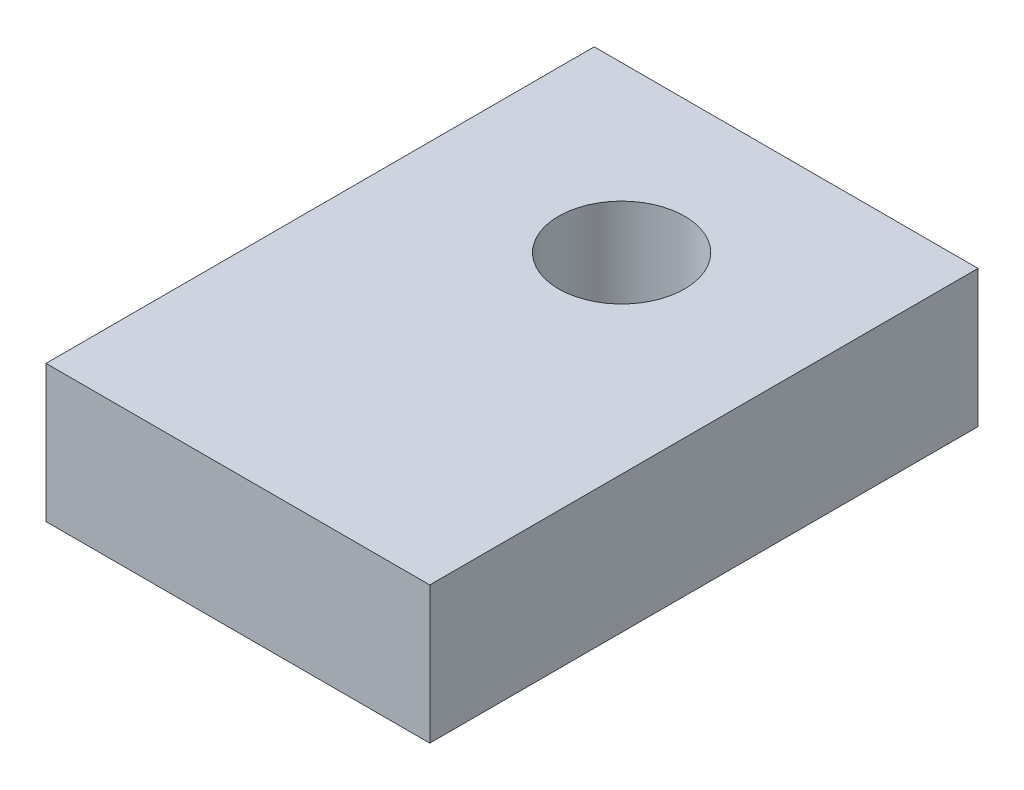
ISO-10303-21;
HEADER;
FILE_DESCRIPTION(('STEP AP214'),'2;1');
FILE_NAME('part.step','',(''),(''),'','','');
FILE_SCHEMA(('AUTOMOTIVE_DESIGN { 1 0 10303 214 1 1 1 1 }'));
ENDSEC;
DATA;
#1=APPLICATION_CONTEXT('core data for automotive mechanical design processes');
#2=APPLICATION_PROTOCOL_DEFINITION('international standard','automotive_design',2000,#1);
#3=PRODUCT_CONTEXT('',#1,'mechanical');
#4=PRODUCT('Part','Part','',(#3));
#5=PRODUCT_RELATED_PRODUCT_CATEGORY('part','',(#4));
#6=PRODUCT_DEFINITION_FORMATION('','',#4);
#7=PRODUCT_DEFINITION_CONTEXT('part definition',#1,'design');
#8=PRODUCT_DEFINITION('design','',#6,#7);
#9=PRODUCT_DEFINITION_SHAPE('','',#8);
#10=(LENGTH_UNIT() NAMED_UNIT(*) SI_UNIT(.MILLI.,.METRE.));
#11=(NAMED_UNIT(*) PLANE_ANGLE_UNIT() SI_UNIT($,.RADIAN.));
#12=(NAMED_UNIT(*) SI_UNIT($,.STERADIAN.) SOLID_ANGLE_UNIT());
#13=UNCERTAINTY_MEASURE_WITH_UNIT(LENGTH_MEASURE(1.E-05),#10,'distance_accuracy_value','');
#14=(GEOMETRIC_REPRESENTATION_CONTEXT(3) GLOBAL_UNCERTAINTY_ASSIGNED_CONTEXT((#13)) GLOBAL_UNIT_ASSIGNED_CONTEXT((#10,
#11,#12)) REPRESENTATION_CONTEXT('',''));
#15=CARTESIAN_POINT('',(0.,0.,0.));
#16=DIRECTION('',(0.,0.,1.));
#17=DIRECTION('',(1.,0.,0.));
#18=AXIS2_PLACEMENT_3D('',#15,#16,#17);
#19=CARTESIAN_POINT('',(0.,3.175,0.));
#20=DIRECTION('',(0.,-1.,0.));
#21=DIRECTION('',(0.,0.,-1.));
#22=AXIS2_PLACEMENT_3D('',#19,#20,#21);
#23=PLANE('',#22);
#24=DIRECTION('',(0.,0.,1.));
#25=VECTOR('',#24,1.);
#26=CARTESIAN_POINT('',(0.,3.175,0.));
#27=LINE('',#26,#25);
#28=CARTESIAN_POINT('',(0.,3.175,-12.7));
#29=VERTEX_POINT('',#28);
#30=CARTESIAN_POINT('',(0.,3.175,0.));
#31=VERTEX_POINT('',#30);
#32=EDGE_CURVE('E91',#29,#31,#27,.T.);
#33=ORIENTED_EDGE('',*,*,#32,.T.);
#34=DIRECTION('',(1.,0.,0.));
#35=VECTOR('',#34,1.);
#36=CARTESIAN_POINT('',(0.,3.175,0.));
#37=LINE('',#36,#35);
#38=CARTESIAN_POINT('',(8.89,3.175,0.));
#39=VERTEX_POINT('',#38);
#40=EDGE_CURVE('E86',#31,#39,#37,.T.);
#41=ORIENTED_EDGE('',*,*,#40,.T.);
#42=DIRECTION('',(0.,0.,-1.));
#43=VECTOR('',#42,1.);
#44=CARTESIAN_POINT('',(8.89,3.175,0.));
#45=LINE('',#44,#43);
#46=CARTESIAN_POINT('',(8.89,3.175,-12.7));
#47=VERTEX_POINT('',#46);
#48=EDGE_CURVE('E89',#39,#47,#45,.T.);
#49=ORIENTED_EDGE('',*,*,#48,.T.);
#50=DIRECTION('',(-1.,0.,0.));
#51=VECTOR('',#50,1.);
#52=CARTESIAN_POINT('',(0.,3.175,-12.7));
#53=LINE('',#52,#51);
#54=EDGE_CURVE('E56',#47,#29,#53,.T.);
#55=ORIENTED_EDGE('',*,*,#54,.T.);
#56=EDGE_LOOP('',(#33,#41,#49,#55));
#57=FACE_BOUND('',#56,.T.);
#58=CARTESIAN_POINT('',(4.445,3.175,-8.89));
#59=DIRECTION('',(0.,1.,0.));
#60=DIRECTION('',(0.,0.,1.));
#61=AXIS2_PLACEMENT_3D('',#58,#59,#60);
#62=CIRCLE('',#61,1.4605);
#63=CARTESIAN_POINT('',(4.445,3.175,-7.4295));
#64=VERTEX_POINT('',#63);
#65=EDGE_CURVE('E106',#64,#64,#62,.T.);
#66=ORIENTED_EDGE('',*,*,#65,.F.);
#67=EDGE_LOOP('',(#66));
#68=FACE_BOUND('',#67,.T.);
#69=ADVANCED_FACE('F39',(#57,#68),#23,.F.);
#70=CARTESIAN_POINT('',(0.,0.,0.));
#71=DIRECTION('',(0.,-1.,0.));
#72=DIRECTION('',(0.,0.,-1.));
#73=AXIS2_PLACEMENT_3D('',#70,#71,#72);
#74=PLANE('',#73);
#75=DIRECTION('',(0.,0.,1.));
#76=VECTOR('',#75,1.);
#77=CARTESIAN_POINT('',(0.,0.,0.));
#78=LINE('',#77,#76);
#79=CARTESIAN_POINT('',(0.,0.,-12.7));
#80=VERTEX_POINT('',#79);
#81=CARTESIAN_POINT('',(0.,0.,0.));
#82=VERTEX_POINT('',#81);
#83=EDGE_CURVE('E103',#80,#82,#78,.T.);
#84=ORIENTED_EDGE('',*,*,#83,.F.);
#85=DIRECTION('',(-1.,0.,0.));
#86=VECTOR('',#85,1.);
#87=CARTESIAN_POINT('',(0.,0.,-12.7));
#88=LINE('',#87,#86);
#89=CARTESIAN_POINT('',(8.89,0.,-12.7));
#90=VERTEX_POINT('',#89);
#91=EDGE_CURVE('E79',#90,#80,#88,.T.);
#92=ORIENTED_EDGE('',*,*,#91,.F.);
#93=DIRECTION('',(0.,0.,-1.));
#94=VECTOR('',#93,1.);
#95=CARTESIAN_POINT('',(8.89,0.,0.));
#96=LINE('',#95,#94);
#97=CARTESIAN_POINT('',(8.89,0.,0.));
#98=VERTEX_POINT('',#97);
#99=EDGE_CURVE('E73',#98,#90,#96,.T.);
#100=ORIENTED_EDGE('',*,*,#99,.F.);
#101=DIRECTION('',(1.,0.,0.));
#102=VECTOR('',#101,1.);
#103=CARTESIAN_POINT('',(0.,0.,0.));
#104=LINE('',#103,#102);
#105=EDGE_CURVE('E95',#82,#98,#104,.T.);
#106=ORIENTED_EDGE('',*,*,#105,.F.);
#107=EDGE_LOOP('',(#84,#92,#100,#106));
#108=FACE_BOUND('',#107,.T.);
#109=CARTESIAN_POINT('',(4.445,0.,-8.89));
#110=DIRECTION('',(0.,1.,0.));
#111=DIRECTION('',(0.,0.,1.));
#112=AXIS2_PLACEMENT_3D('',#109,#110,#111);
#113=CIRCLE('',#112,1.4605);
#114=CARTESIAN_POINT('',(4.445,0.,-7.4295));
#115=VERTEX_POINT('',#114);
#116=EDGE_CURVE('E118',#115,#115,#113,.T.);
#117=ORIENTED_EDGE('',*,*,#116,.T.);
#118=EDGE_LOOP('',(#117));
#119=FACE_BOUND('',#118,.T.);
#120=ADVANCED_FACE('F114',(#108,#119),#74,.T.);
#121=CARTESIAN_POINT('',(0.,3.175,0.));
#122=DIRECTION('',(1.,0.,0.));
#123=DIRECTION('',(0.,0.,-1.));
#124=AXIS2_PLACEMENT_3D('',#121,#122,#123);
#125=PLANE('',#124);
#126=ORIENTED_EDGE('',*,*,#83,.T.);
#127=DIRECTION('',(0.,-1.,0.));
#128=VECTOR('',#127,1.);
#129=CARTESIAN_POINT('',(0.,3.175,0.));
#130=LINE('',#129,#128);
#131=EDGE_CURVE('E11',#31,#82,#130,.T.);
#132=ORIENTED_EDGE('',*,*,#131,.F.);
#133=ORIENTED_EDGE('',*,*,#32,.F.);
#134=DIRECTION('',(0.,-1.,0.));
#135=VECTOR('',#134,1.);
#136=CARTESIAN_POINT('',(0.,3.175,-12.7));
#137=LINE('',#136,#135);
#138=EDGE_CURVE('E99',#29,#80,#137,.T.);
#139=ORIENTED_EDGE('',*,*,#138,.T.);
#140=EDGE_LOOP('',(#126,#132,#133,#139));
#141=FACE_BOUND('',#140,.T.);
#142=ADVANCED_FACE('F41',(#141),#125,.F.);
#143=CARTESIAN_POINT('',(0.,3.175,0.));
#144=DIRECTION('',(0.,0.,-1.));
#145=DIRECTION('',(-1.,0.,0.));
#146=AXIS2_PLACEMENT_3D('',#143,#144,#145);
#147=PLANE('',#146);
#148=ORIENTED_EDGE('',*,*,#105,.T.);
#149=DIRECTION('',(0.,-1.,0.));
#150=VECTOR('',#149,1.);
#151=CARTESIAN_POINT('',(8.89,3.175,0.));
#152=LINE('',#151,#150);
#153=EDGE_CURVE('E48',#39,#98,#152,.T.);
#154=ORIENTED_EDGE('',*,*,#153,.F.);
#155=ORIENTED_EDGE('',*,*,#40,.F.);
#156=ORIENTED_EDGE('',*,*,#131,.T.);
#157=EDGE_LOOP('',(#148,#154,#155,#156));
#158=FACE_BOUND('',#157,.T.);
#159=ADVANCED_FACE('F94',(#158),#147,.F.);
#160=CARTESIAN_POINT('',(8.89,3.175,0.));
#161=DIRECTION('',(-1.,0.,0.));
#162=DIRECTION('',(0.,0.,1.));
#163=AXIS2_PLACEMENT_3D('',#160,#161,#162);
#164=PLANE('',#163);
#165=ORIENTED_EDGE('',*,*,#99,.T.);
#166=DIRECTION('',(0.,-1.,0.));
#167=VECTOR('',#166,1.);
#168=CARTESIAN_POINT('',(8.89,3.175,-12.7));
#169=LINE('',#168,#167);
#170=EDGE_CURVE('E96',#47,#90,#169,.T.);
#171=ORIENTED_EDGE('',*,*,#170,.F.);
#172=ORIENTED_EDGE('',*,*,#48,.F.);
#173=ORIENTED_EDGE('',*,*,#153,.T.);
#174=EDGE_LOOP('',(#165,#171,#172,#173));
#175=FACE_BOUND('',#174,.T.);
#176=ADVANCED_FACE('F97',(#175),#164,.F.);
#177=CARTESIAN_POINT('',(0.,3.175,-12.7));
#178=DIRECTION('',(0.,0.,1.));
#179=DIRECTION('',(1.,0.,0.));
#180=AXIS2_PLACEMENT_3D('',#177,#178,#179);
#181=PLANE('',#180);
#182=ORIENTED_EDGE('',*,*,#91,.T.);
#183=ORIENTED_EDGE('',*,*,#138,.F.);
#184=ORIENTED_EDGE('',*,*,#54,.F.);
#185=ORIENTED_EDGE('',*,*,#170,.T.);
#186=EDGE_LOOP('',(#182,#183,#184,#185));
#187=FACE_BOUND('',#186,.T.);
#188=ADVANCED_FACE('F111',(#187),#181,.F.);
#189=CARTESIAN_POINT('',(4.445,3.175,-8.89));
#190=DIRECTION('',(0.,-1.,0.));
#191=DIRECTION('',(0.,0.,-1.));
#192=AXIS2_PLACEMENT_3D('',#189,#190,#191);
#193=CYLINDRICAL_SURFACE('',#192,1.4605);
#194=ORIENTED_EDGE('',*,*,#65,.T.);
#195=EDGE_LOOP('',(#194));
#196=FACE_BOUND('',#195,.T.);
#197=ORIENTED_EDGE('',*,*,#116,.F.);
#198=EDGE_LOOP('',(#197));
#199=FACE_BOUND('',#198,.T.);
#200=ADVANCED_FACE('F124',(#196,#199),#193,.F.);
#201=CLOSED_SHELL('',(#69,#120,#142,#159,#176,#188,#200));
#202=MANIFOLD_SOLID_BREP('B2',#201);
#203=ADVANCED_BREP_SHAPE_REPRESENTATION('',(#18,#202),#14);
#204=SHAPE_DEFINITION_REPRESENTATION(#9,#203);
ENDSEC;
END-ISO-10303-21;
